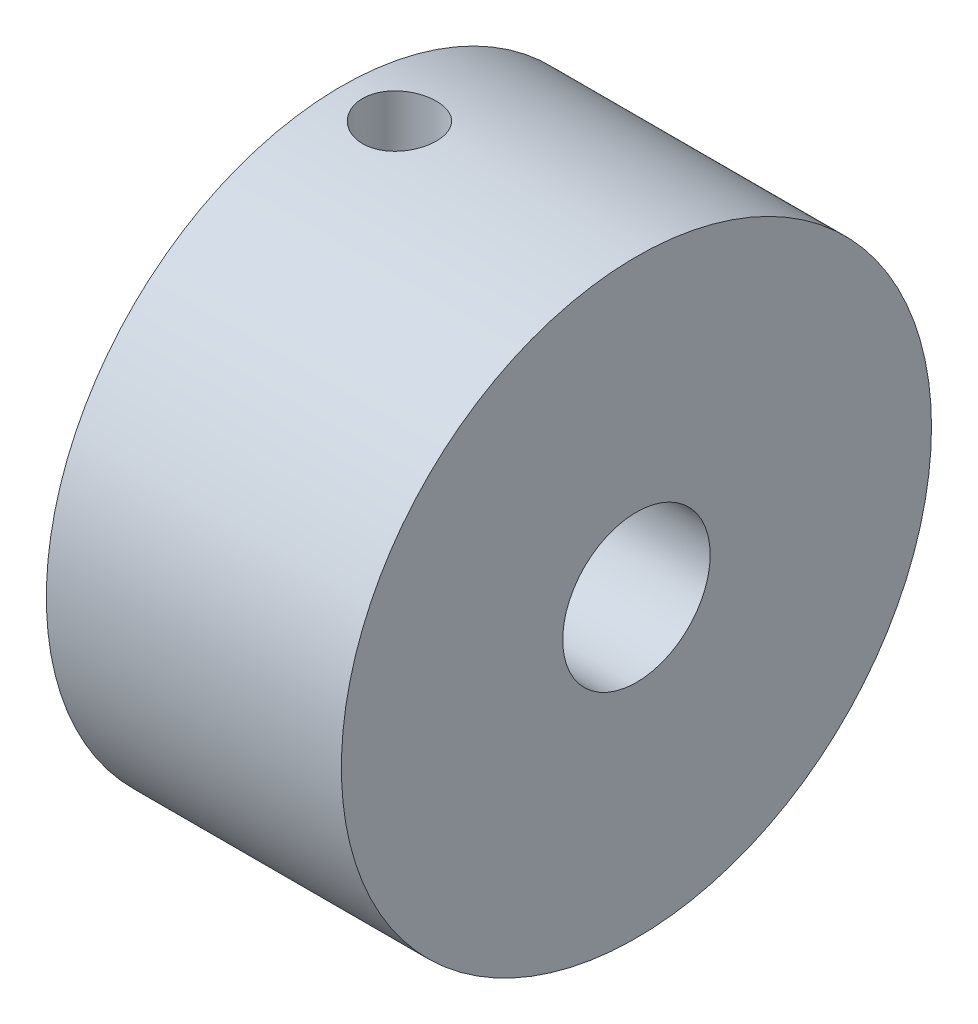
ISO-10303-21;
HEADER;
FILE_DESCRIPTION(('STEP AP214'),'2;1');
FILE_NAME('part.step','',(''),(''),'','','');
FILE_SCHEMA(('AUTOMOTIVE_DESIGN { 1 0 10303 214 1 1 1 1 }'));
ENDSEC;
DATA;
#1=APPLICATION_CONTEXT('core data for automotive mechanical design processes');
#2=APPLICATION_PROTOCOL_DEFINITION('international standard','automotive_design',2000,#1);
#3=PRODUCT_CONTEXT('',#1,'mechanical');
#4=PRODUCT('Part','Part','',(#3));
#5=PRODUCT_RELATED_PRODUCT_CATEGORY('part','',(#4));
#6=PRODUCT_DEFINITION_FORMATION('','',#4);
#7=PRODUCT_DEFINITION_CONTEXT('part definition',#1,'design');
#8=PRODUCT_DEFINITION('design','',#6,#7);
#9=PRODUCT_DEFINITION_SHAPE('','',#8);
#10=(LENGTH_UNIT() NAMED_UNIT(*) SI_UNIT(.MILLI.,.METRE.));
#11=(NAMED_UNIT(*) PLANE_ANGLE_UNIT() SI_UNIT($,.RADIAN.));
#12=(NAMED_UNIT(*) SI_UNIT($,.STERADIAN.) SOLID_ANGLE_UNIT());
#13=UNCERTAINTY_MEASURE_WITH_UNIT(LENGTH_MEASURE(1.E-05),#10,'distance_accuracy_value','');
#14=(GEOMETRIC_REPRESENTATION_CONTEXT(3) GLOBAL_UNCERTAINTY_ASSIGNED_CONTEXT((#13)) GLOBAL_UNIT_ASSIGNED_CONTEXT((#10,
#11,#12)) REPRESENTATION_CONTEXT('',''));
#15=CARTESIAN_POINT('',(0.,0.,0.));
#16=DIRECTION('',(0.,0.,1.));
#17=DIRECTION('',(1.,0.,0.));
#18=AXIS2_PLACEMENT_3D('',#15,#16,#17);
#19=CARTESIAN_POINT('',(12.7,0.,0.));
#20=DIRECTION('',(-1.,0.,0.));
#21=DIRECTION('',(0.,0.,1.));
#22=AXIS2_PLACEMENT_3D('',#19,#20,#21);
#23=CYLINDRICAL_SURFACE('',#22,12.7);
#24=CARTESIAN_POINT('',(2.5,12.6003906189451,-1.5875));
#25=CARTESIAN_POINT('',(2.58879604020781,12.6003918944879,-1.58749622481955));
#26=CARTESIAN_POINT('',(2.67764757771456,12.6013393840053,-1.58002471587851));
#27=CARTESIAN_POINT('',(2.85287789813193,12.6050255327228,-1.55033752271305));
#28=CARTESIAN_POINT('',(2.93925399861562,12.6077660635828,-1.52810643139297));
#29=CARTESIAN_POINT('',(3.10697102514368,12.614723143474,-1.46956569994448));
#30=CARTESIAN_POINT('',(3.18831532524535,12.6189386905307,-1.43326561504688));
#31=CARTESIAN_POINT('',(3.34374256690765,12.6283696093514,-1.34763776600275));
#32=CARTESIAN_POINT('',(3.41782674685684,12.6335848101502,-1.29831222898299));
#33=CARTESIAN_POINT('',(3.55706052692255,12.6444601011988,-1.1877379409179));
#34=CARTESIAN_POINT('',(3.62216361947249,12.650122284808,-1.12643082754043));
#35=CARTESIAN_POINT('',(3.74118545827631,12.6612347287615,-0.993759290526229));
#36=CARTESIAN_POINT('',(3.79510364810013,12.6666849785516,-0.92239436682685));
#37=CARTESIAN_POINT('',(3.89039192298654,12.6767808732914,-0.77134074247924));
#38=CARTESIAN_POINT('',(3.93171992363828,12.6814237979272,-0.691625296681306));
#39=CARTESIAN_POINT('',(4.00038511196251,12.6893589046612,-0.526317665965506));
#40=CARTESIAN_POINT('',(4.02772281889834,12.6926511368908,-0.440725699294174));
#41=CARTESIAN_POINT('',(4.06749246339236,12.6974991712845,-0.266570261721956));
#42=CARTESIAN_POINT('',(4.08000171586267,12.6990639772082,-0.178024700886245));
#43=CARTESIAN_POINT('',(4.0899989694982,12.7003115927805,-7.82324359571408E-05));
#44=CARTESIAN_POINT('',(4.08748756158986,12.6999944764657,0.0893226413916794));
#45=CARTESIAN_POINT('',(4.06757674624903,12.6975212633396,0.265915945798837));
#46=CARTESIAN_POINT('',(4.05026048946432,12.6953754375939,0.353117915660427));
#47=CARTESIAN_POINT('',(4.00136150283999,12.6894974552338,0.523368374079913));
#48=CARTESIAN_POINT('',(3.96977850178406,12.6857652684622,0.606416783643689));
#49=CARTESIAN_POINT('',(3.8931541270823,12.6771162370803,0.766260097803535));
#50=CARTESIAN_POINT('',(3.84807676934133,12.6721962319046,0.843037574678728));
#51=CARTESIAN_POINT('',(3.74576943999282,12.6617220035645,0.987969482214611));
#52=CARTESIAN_POINT('',(3.68853891103745,12.6561677513189,1.05612351717302));
#53=CARTESIAN_POINT('',(3.56308409519003,12.6450018087743,1.18236239954082));
#54=CARTESIAN_POINT('',(3.49478734268787,12.63938998536,1.24037524339746));
#55=CARTESIAN_POINT('',(3.34938771144314,12.6287788568227,1.34412536014694));
#56=CARTESIAN_POINT('',(3.27228480509833,12.6237795536196,1.38986259456128));
#57=CARTESIAN_POINT('',(3.11139737031792,12.6149595465908,1.46776730422503));
#58=CARTESIAN_POINT('',(3.02761001922972,12.6111393440166,1.49992901046258));
#59=CARTESIAN_POINT('',(2.85576544701046,12.6051198398493,1.54970585058723));
#60=CARTESIAN_POINT('',(2.76770843187396,12.6029204601406,1.56732168551776));
#61=CARTESIAN_POINT('',(2.59046007943015,12.6004058937787,1.58741137426196));
#62=CARTESIAN_POINT('',(2.50128039933862,12.6000780982591,1.58998655966891));
#63=CARTESIAN_POINT('',(2.32376087466246,12.6013104661098,1.5801892153014));
#64=CARTESIAN_POINT('',(2.23542101221764,12.6028705892392,1.56781700412973));
#65=CARTESIAN_POINT('',(2.06239244012806,12.6076915008733,1.52856138648155));
#66=CARTESIAN_POINT('',(1.97769242435409,12.6109465376111,1.50172704717875));
#67=CARTESIAN_POINT('',(1.81399416166825,12.6187858493146,1.43435941163874));
#68=CARTESIAN_POINT('',(1.73499611520205,12.6233701709813,1.39382563409908));
#69=CARTESIAN_POINT('',(1.58448580117875,12.633381714093,1.29996058406837));
#70=CARTESIAN_POINT('',(1.51301526752534,12.6388132588805,1.24656286093146));
#71=CARTESIAN_POINT('',(1.38001458825126,12.649893671149,1.12857962140429));
#72=CARTESIAN_POINT('',(1.31848482946383,12.6555425470767,1.06399366984018));
#73=CARTESIAN_POINT('',(1.20675634104265,12.6664598631622,0.925024677479661));
#74=CARTESIAN_POINT('',(1.15662419628518,12.6717259513445,0.850587892494316));
#75=CARTESIAN_POINT('',(1.06957473180254,12.6812491677507,0.694291589367936));
#76=CARTESIAN_POINT('',(1.03265714571459,12.685506316311,0.612432220883885));
#77=CARTESIAN_POINT('',(0.973194705313403,12.6925215456477,0.443835700553554));
#78=CARTESIAN_POINT('',(0.950611369019929,12.6952836371169,0.35711229473498));
#79=CARTESIAN_POINT('',(0.920333303341012,12.6990141922025,0.181067746371505));
#80=CARTESIAN_POINT('',(0.912637902569488,12.6999827367006,0.0917467211531987));
#81=CARTESIAN_POINT('',(0.912366699344484,12.7000166878868,-0.086307411423302));
#82=CARTESIAN_POINT('',(0.919688225039341,12.6990950181158,-0.175040377448855));
#83=CARTESIAN_POINT('',(0.949025589528582,12.6954777913529,-0.350004215822408));
#84=CARTESIAN_POINT('',(0.971041418103468,12.6927822355947,-0.436235089910503));
#85=CARTESIAN_POINT('',(1.02911020261206,12.6859187810964,-0.603733516296943));
#86=CARTESIAN_POINT('',(1.065158241402,12.6817513981589,-0.685002795701326));
#87=CARTESIAN_POINT('',(1.1502575347758,12.6724057422999,-0.840354769086453));
#88=CARTESIAN_POINT('',(1.19930894394618,12.6672274573608,-0.914437377616397));
#89=CARTESIAN_POINT('',(1.3094024417386,12.6563957814274,-1.05383759765622));
#90=CARTESIAN_POINT('',(1.37052092388752,12.6507395021211,-1.11909465527478));
#91=CARTESIAN_POINT('',(1.50285501945833,12.639612509736,-1.23846661045028));
#92=CARTESIAN_POINT('',(1.57407302120673,12.6341418409304,-1.29257886504886));
#93=CARTESIAN_POINT('',(1.72489990091283,12.6239829523563,-1.38830382899768));
#94=CARTESIAN_POINT('',(1.80454011960878,12.619297835727,-1.42986746231087));
#95=CARTESIAN_POINT('',(1.96968403027767,12.6112768990596,-1.49897165809803));
#96=CARTESIAN_POINT('',(2.05518122955766,12.6079396123271,-1.52652747222998));
#97=CARTESIAN_POINT('',(2.20093404177264,12.603802496306,-1.56023684411111));
#98=CARTESIAN_POINT('',(2.26027032422636,12.6025294146641,-1.57044582469172));
#99=CARTESIAN_POINT('',(2.379729253729,12.6008230471599,-1.5840786555));
#100=CARTESIAN_POINT('',(2.43985189480811,12.6003897549259,-1.58750255720806));
#101=CARTESIAN_POINT('',(2.5,12.6003906189451,-1.5875));
#102=B_SPLINE_CURVE_WITH_KNOTS('',3,(#24,#25,#26,#27,#28,#29,#30,#31,#32,#33,#34,#35,#36,#37,
#38,#39,#40,#41,#42,#43,#44,#45,#46,#47,#48,#49,#50,#51,#52,#53,#54,#55,#56,#57,#58,#59,#60,#61,
#62,#63,#64,#65,#66,#67,#68,#69,#70,#71,#72,#73,#74,#75,#76,#77,#78,#79,#80,#81,#82,#83,#84,#85,
#86,#87,#88,#89,#90,#91,#92,#93,#94,#95,#96,#97,#98,#99,#100,#101),.UNSPECIFIED.,.T.,.F.,(4,2,2,
2,2,2,2,2,2,2,2,2,2,2,2,2,2,2,2,2,2,2,2,2,2,2,2,2,2,2,2,2,2,2,2,2,2,2,4),(0.,0.266168389099316,
0.532615061356761,0.798881087389061,1.06510161598639,1.33265276743657,1.60021722591537,
1.86866648202545,2.13710577365792,2.40413919057825,2.67116210223019,2.93669507232479,
3.20223309051586,3.4684855980213,3.73475031857881,4.00283487834883,4.27092027843334,
4.5391194887927,4.80730577244179,5.07368313306735,5.34005481597718,5.60552838945884,
5.87101129079526,6.1378961541051,6.40479140041704,6.67320792541636,6.94161903970136,
7.20930649058436,7.47698186955734,7.74283323343041,8.00868441241109,8.27444251600496,
8.54020377912296,8.8077048184568,9.0752692220429,9.34386687042568,9.61217144098579,
9.79246828416921,9.97276375938224),.UNSPECIFIED.);
#103=CARTESIAN_POINT('',(2.5,12.6003906189451,-1.5875));
#104=VERTEX_POINT('',#103);
#105=EDGE_CURVE('E37',#104,#104,#102,.T.);
#106=ORIENTED_EDGE('',*,*,#105,.T.);
#107=EDGE_LOOP('',(#106));
#108=FACE_BOUND('',#107,.T.);
#109=CARTESIAN_POINT('',(12.7,0.,0.));
#110=DIRECTION('',(1.,0.,0.));
#111=DIRECTION('',(0.,0.,-1.));
#112=AXIS2_PLACEMENT_3D('',#109,#110,#111);
#113=CIRCLE('',#112,12.7);
#114=CARTESIAN_POINT('',(12.7,0.,-12.7));
#115=VERTEX_POINT('',#114);
#116=EDGE_CURVE('E10',#115,#115,#113,.T.);
#117=ORIENTED_EDGE('',*,*,#116,.F.);
#118=EDGE_LOOP('',(#117));
#119=FACE_BOUND('',#118,.T.);
#120=CARTESIAN_POINT('',(0.,0.,0.));
#121=DIRECTION('',(1.,0.,0.));
#122=DIRECTION('',(0.,0.,-1.));
#123=AXIS2_PLACEMENT_3D('',#120,#121,#122);
#124=CIRCLE('',#123,12.7);
#125=CARTESIAN_POINT('',(0.,0.,-12.7));
#126=VERTEX_POINT('',#125);
#127=EDGE_CURVE('E44',#126,#126,#124,.T.);
#128=ORIENTED_EDGE('',*,*,#127,.T.);
#129=EDGE_LOOP('',(#128));
#130=FACE_BOUND('',#129,.T.);
#131=ADVANCED_FACE('F33',(#108,#119,#130),#23,.T.);
#132=CARTESIAN_POINT('',(12.7,0.,0.));
#133=DIRECTION('',(1.,0.,0.));
#134=DIRECTION('',(0.,0.,-1.));
#135=AXIS2_PLACEMENT_3D('',#132,#133,#134);
#136=PLANE('',#135);
#137=CARTESIAN_POINT('',(12.7,0.,0.));
#138=DIRECTION('',(1.,0.,0.));
#139=DIRECTION('',(0.,0.,-1.));
#140=AXIS2_PLACEMENT_3D('',#137,#138,#139);
#141=CIRCLE('',#140,3.175);
#142=CARTESIAN_POINT('',(12.7,0.,-3.175));
#143=VERTEX_POINT('',#142);
#144=EDGE_CURVE('E59',#143,#143,#141,.T.);
#145=ORIENTED_EDGE('',*,*,#144,.F.);
#146=EDGE_LOOP('',(#145));
#147=FACE_BOUND('',#146,.T.);
#148=ORIENTED_EDGE('',*,*,#116,.T.);
#149=EDGE_LOOP('',(#148));
#150=FACE_BOUND('',#149,.T.);
#151=ADVANCED_FACE('F91',(#147,#150),#136,.T.);
#152=CARTESIAN_POINT('',(0.,0.,0.));
#153=DIRECTION('',(1.,0.,0.));
#154=DIRECTION('',(0.,0.,-1.));
#155=AXIS2_PLACEMENT_3D('',#152,#153,#154);
#156=PLANE('',#155);
#157=CARTESIAN_POINT('',(0.,0.,0.));
#158=DIRECTION('',(-1.,0.,0.));
#159=DIRECTION('',(0.,0.,1.));
#160=AXIS2_PLACEMENT_3D('',#157,#158,#159);
#161=CIRCLE('',#160,3.5);
#162=CARTESIAN_POINT('',(0.,0.,3.5));
#163=VERTEX_POINT('',#162);
#164=EDGE_CURVE('E51',#163,#163,#161,.T.);
#165=ORIENTED_EDGE('',*,*,#164,.F.);
#166=EDGE_LOOP('',(#165));
#167=FACE_BOUND('',#166,.T.);
#168=ORIENTED_EDGE('',*,*,#127,.F.);
#169=EDGE_LOOP('',(#168));
#170=FACE_BOUND('',#169,.T.);
#171=ADVANCED_FACE('F86',(#167,#170),#156,.F.);
#172=CARTESIAN_POINT('',(5.,0.,0.));
#173=DIRECTION('',(-1.,0.,0.));
#174=DIRECTION('',(0.,0.,1.));
#175=AXIS2_PLACEMENT_3D('',#172,#173,#174);
#176=CYLINDRICAL_SURFACE('',#175,3.5);
#177=CARTESIAN_POINT('',(2.5,3.11926974627075,-1.5875));
#178=CARTESIAN_POINT('',(2.4161468105634,3.11927469952813,-1.58749558083635));
#179=CARTESIAN_POINT('',(2.33216232474372,3.12270051069473,-1.580813484561));
#180=CARTESIAN_POINT('',(2.16668187245174,3.13593607771734,-1.55438475427074));
#181=CARTESIAN_POINT('',(2.08519257425309,3.14576160129889,-1.53460585010137));
#182=CARTESIAN_POINT('',(1.92739701460033,3.17043616807945,-1.4829504177073));
#183=CARTESIAN_POINT('',(1.85106882702513,3.18526211592426,-1.45112942701445));
#184=CARTESIAN_POINT('',(1.70485339317184,3.21823190302146,-1.37646042382742));
#185=CARTESIAN_POINT('',(1.63496544373145,3.23637537941023,-1.33361361710301));
#186=CARTESIAN_POINT('',(1.49840174056701,3.27543499871804,-1.23471985840772));
#187=CARTESIAN_POINT('',(1.43225812973366,3.29645554977554,-1.17797894448261));
#188=CARTESIAN_POINT('',(1.31002355407957,3.33805023373342,-1.05435906926123));
#189=CARTESIAN_POINT('',(1.25393690634427,3.35862417160427,-0.987475776842987));
#190=CARTESIAN_POINT('',(1.1505112925715,3.39831727452614,-0.841118407916727));
#191=CARTESIAN_POINT('',(1.10379476521927,3.41730123157187,-0.761164422355774));
#192=CARTESIAN_POINT('',(1.02471171094369,3.45036577143234,-0.593512644398512));
#193=CARTESIAN_POINT('',(0.992337691483703,3.46444891360953,-0.505818924027817));
#194=CARTESIAN_POINT('',(0.944861623154755,3.48537994942034,-0.330786596950972));
#195=CARTESIAN_POINT('',(0.928835440827173,3.49261306530712,-0.243745705670749));
#196=CARTESIAN_POINT('',(0.911499590065816,3.5004447581034,-0.0679308765972407));
#197=CARTESIAN_POINT('',(0.91018276037973,3.50104656346629,0.0208421967925786));
#198=CARTESIAN_POINT('',(0.921872006794525,3.49575634470729,0.190787459702594));
#199=CARTESIAN_POINT('',(0.93385541840991,3.4903279594494,0.2720473566017));
#200=CARTESIAN_POINT('',(0.970019635970755,3.4742513300331,0.431255793842827));
#201=CARTESIAN_POINT('',(0.994201346258583,3.46360269886422,0.50920408820875));
#202=CARTESIAN_POINT('',(1.05432358211,3.43788844461163,0.66101876142212));
#203=CARTESIAN_POINT('',(1.09043664294508,3.42275837067883,0.734805443735466));
#204=CARTESIAN_POINT('',(1.17320516947324,3.38951225901898,0.875464370224224));
#205=CARTESIAN_POINT('',(1.21986449534746,3.37139512861756,0.942334069524796));
#206=CARTESIAN_POINT('',(1.32678763630395,3.33220657512055,1.07304495741821));
#207=CARTESIAN_POINT('',(1.38784880010665,3.3110147170979,1.13619861557071));
#208=CARTESIAN_POINT('',(1.51964935974569,3.26910222408757,1.25170026298327));
#209=CARTESIAN_POINT('',(1.59039393172875,3.24838184808014,1.30404243529658));
#210=CARTESIAN_POINT('',(1.74350286215392,3.20880525771161,1.39868585931047));
#211=CARTESIAN_POINT('',(1.82624611461452,3.19007436643428,1.44043134603845));
#212=CARTESIAN_POINT('',(1.99865540773856,3.15817195754399,1.50910566793521));
#213=CARTESIAN_POINT('',(2.08831537989885,3.14499563071084,1.53604732662619));
#214=CARTESIAN_POINT('',(2.26511006353992,3.12695694904156,1.57242697107142));
#215=CARTESIAN_POINT('',(2.35195708388087,3.1215613967434,1.58299170819789));
#216=CARTESIAN_POINT('',(2.52633217491316,3.11816523918286,1.58967460005493));
#217=CARTESIAN_POINT('',(2.61385990734305,3.12016116934008,1.58579952309727));
#218=CARTESIAN_POINT('',(2.77951493948326,3.13076461989938,1.56474490869399));
#219=CARTESIAN_POINT('',(2.85782472229454,3.13881682727836,1.54868187469284));
#220=CARTESIAN_POINT('',(3.01054026789645,3.15986817503221,1.50526102680377));
#221=CARTESIAN_POINT('',(3.08494499037325,3.17286862609104,1.47790022021435));
#222=CARTESIAN_POINT('',(3.23153125718652,3.2030606197528,1.41130871848201));
#223=CARTESIAN_POINT('',(3.30345908222036,3.22041544961612,1.37159612478553));
#224=CARTESIAN_POINT('',(3.44001205142446,3.25716639749154,1.28187959812687));
#225=CARTESIAN_POINT('',(3.50463366031441,3.27656349500941,1.23187071580458));
#226=CARTESIAN_POINT('',(3.63146536142608,3.31754454425126,1.11712298070886));
#227=CARTESIAN_POINT('',(3.69279199256306,3.33915364078929,1.0514124287276));
#228=CARTESIAN_POINT('',(3.80375740319744,3.38038011426498,0.9101854185289));
#229=CARTESIAN_POINT('',(3.85339422026871,3.3999971564728,0.834667317166908));
#230=CARTESIAN_POINT('',(3.93991443199328,3.43534833404719,0.674654587072162));
#231=CARTESIAN_POINT('',(3.97665278950985,3.45103777531002,0.590071018963615));
#232=CARTESIAN_POINT('',(4.03506179287448,3.47642927541063,0.415016188790065));
#233=CARTESIAN_POINT('',(4.05674324525686,3.48613562782466,0.324549200438387));
#234=CARTESIAN_POINT('',(4.08288572081969,3.4978921137529,0.148112919884642));
#235=CARTESIAN_POINT('',(4.0885859537609,3.500492773568,0.0623630450793799));
#236=CARTESIAN_POINT('',(4.086073281839,3.49935267208743,-0.108879065124292));
#237=CARTESIAN_POINT('',(4.0778636990123,3.49561342493113,-0.194371357155574));
#238=CARTESIAN_POINT('',(4.04864311485482,3.4825252197569,-0.358435958003041));
#239=CARTESIAN_POINT('',(4.0282596069059,3.47345155633863,-0.437143993746937));
#240=CARTESIAN_POINT('',(3.97602020594994,3.4507864663423,-0.589952792019754));
#241=CARTESIAN_POINT('',(3.94416236034391,3.43719427087167,-0.664052767872483));
#242=CARTESIAN_POINT('',(3.86828528892884,3.40599464154685,-0.809302871028499));
#243=CARTESIAN_POINT('',(3.82377636359044,3.38823196079632,-0.8801629501978));
#244=CARTESIAN_POINT('',(3.72452330155038,3.35070016422292,-1.01372031497808));
#245=CARTESIAN_POINT('',(3.66977470412085,3.33093017567509,-1.07641402278755));
#246=CARTESIAN_POINT('',(3.54632175167538,3.28952581859909,-1.19725877205542));
#247=CARTESIAN_POINT('',(3.47683965332759,3.26787192300907,-1.25461127150201));
#248=CARTESIAN_POINT('',(3.32868639854161,3.22668728745559,-1.35703584747372));
#249=CARTESIAN_POINT('',(3.25000926614595,3.20715794435932,-1.40209987346015));
#250=CARTESIAN_POINT('',(3.08464974612651,3.17255125210486,-1.47875257032238));
#251=CARTESIAN_POINT('',(2.99791147803203,3.1575085769168,-1.51023708799707));
#252=CARTESIAN_POINT('',(2.81957155258714,3.13436340538964,-1.55771773696021));
#253=CARTESIAN_POINT('',(2.72798732344402,3.12623762433063,-1.573765856553));
#254=CARTESIAN_POINT('',(2.61314563539887,3.12123822327164,-1.58362601561088));
#255=CARTESIAN_POINT('',(2.59055028637813,3.12050175573591,-1.58507721906137));
#256=CARTESIAN_POINT('',(2.54530648827295,3.1195168395194,-1.58701482512146));
#257=CARTESIAN_POINT('',(2.52265803736541,3.11926840784712,-1.58750119410574));
#258=CARTESIAN_POINT('',(2.5,3.11926974627075,-1.5875));
#259=B_SPLINE_CURVE_WITH_KNOTS('',3,(#177,#178,#179,#180,#181,#182,#183,#184,#185,#186,#187,
#188,#189,#190,#191,#192,#193,#194,#195,#196,#197,#198,#199,#200,#201,#202,#203,#204,#205,#206,
#207,#208,#209,#210,#211,#212,#213,#214,#215,#216,#217,#218,#219,#220,#221,#222,#223,#224,#225,
#226,#227,#228,#229,#230,#231,#232,#233,#234,#235,#236,#237,#238,#239,#240,#241,#242,#243,#244,
#245,#246,#247,#248,#249,#250,#251,#252,#253,#254,#255,#256,#257,#258),.UNSPECIFIED.,.T.,.F.,(4,
2,2,2,2,2,2,2,2,2,2,2,2,2,2,2,2,2,2,2,2,2,2,2,2,2,2,2,2,2,2,2,2,2,2,2,2,2,2,2,4),(0.,
0.251464285831887,0.503550489511857,0.754487978957087,1.00539803783878,1.27318279505324,
1.541082228684,1.82320337457192,2.10517696587779,2.37014019842006,2.63497442791542,
2.88077353986501,3.12659087724366,3.37613099776293,3.62576260417427,3.89567712796776,
4.16573649882654,4.4479106388785,4.72983996429448,4.99134294825229,5.25272337446611,
5.49268032479522,5.73270087887207,5.98360304055623,6.23462609207465,6.51068743402489,
6.78679508675747,7.06591485691259,7.34483409160779,7.60143295758341,7.85797054951791,
8.10230554727601,8.3466821434139,8.60223888549419,8.85790721665243,9.13461770356229,
9.41150903845081,9.69048788090911,9.96852382510168,10.0364698229066,10.1044181886482),.UNSPECIFIED.);
#260=CARTESIAN_POINT('',(2.5,3.11926974627075,-1.5875));
#261=VERTEX_POINT('',#260);
#262=EDGE_CURVE('E62',#261,#261,#259,.T.);
#263=ORIENTED_EDGE('',*,*,#262,.T.);
#264=EDGE_LOOP('',(#263));
#265=FACE_BOUND('',#264,.T.);
#266=CARTESIAN_POINT('',(5.,0.,0.));
#267=DIRECTION('',(-1.,0.,0.));
#268=DIRECTION('',(0.,0.,1.));
#269=AXIS2_PLACEMENT_3D('',#266,#267,#268);
#270=CIRCLE('',#269,3.5);
#271=CARTESIAN_POINT('',(5.,0.,3.5));
#272=VERTEX_POINT('',#271);
#273=EDGE_CURVE('E49',#272,#272,#270,.T.);
#274=ORIENTED_EDGE('',*,*,#273,.F.);
#275=EDGE_LOOP('',(#274));
#276=FACE_BOUND('',#275,.T.);
#277=ORIENTED_EDGE('',*,*,#164,.T.);
#278=EDGE_LOOP('',(#277));
#279=FACE_BOUND('',#278,.T.);
#280=ADVANCED_FACE('F67',(#265,#276,#279),#176,.F.);
#281=CARTESIAN_POINT('',(5.,0.,0.));
#282=DIRECTION('',(-1.,0.,0.));
#283=DIRECTION('',(0.,0.,1.));
#284=AXIS2_PLACEMENT_3D('',#281,#282,#283);
#285=PLANE('',#284);
#286=CARTESIAN_POINT('',(5.,0.,0.));
#287=DIRECTION('',(-1.,0.,0.));
#288=DIRECTION('',(0.,0.,1.));
#289=AXIS2_PLACEMENT_3D('',#286,#287,#288);
#290=CIRCLE('',#289,3.175);
#291=CARTESIAN_POINT('',(5.,0.,3.175));
#292=VERTEX_POINT('',#291);
#293=EDGE_CURVE('E54',#292,#292,#290,.T.);
#294=ORIENTED_EDGE('',*,*,#293,.F.);
#295=EDGE_LOOP('',(#294));
#296=FACE_BOUND('',#295,.T.);
#297=ORIENTED_EDGE('',*,*,#273,.T.);
#298=EDGE_LOOP('',(#297));
#299=FACE_BOUND('',#298,.T.);
#300=ADVANCED_FACE('F79',(#296,#299),#285,.T.);
#301=CARTESIAN_POINT('',(12.7,0.,0.));
#302=DIRECTION('',(1.,0.,0.));
#303=DIRECTION('',(0.,0.,-1.));
#304=AXIS2_PLACEMENT_3D('',#301,#302,#303);
#305=CYLINDRICAL_SURFACE('',#304,3.175);
#306=ORIENTED_EDGE('',*,*,#293,.T.);
#307=EDGE_LOOP('',(#306));
#308=FACE_BOUND('',#307,.T.);
#309=ORIENTED_EDGE('',*,*,#144,.T.);
#310=EDGE_LOOP('',(#309));
#311=FACE_BOUND('',#310,.T.);
#312=ADVANCED_FACE('F75',(#308,#311),#305,.F.);
#313=CARTESIAN_POINT('',(2.5,0.,0.));
#314=DIRECTION('',(0.,-1.,0.));
#315=DIRECTION('',(0.,0.,-1.));
#316=AXIS2_PLACEMENT_3D('',#313,#314,#315);
#317=CYLINDRICAL_SURFACE('',#316,1.5875);
#318=ORIENTED_EDGE('',*,*,#105,.F.);
#319=EDGE_LOOP('',(#318));
#320=FACE_BOUND('',#319,.T.);
#321=ORIENTED_EDGE('',*,*,#262,.F.);
#322=EDGE_LOOP('',(#321));
#323=FACE_BOUND('',#322,.T.);
#324=ADVANCED_FACE('F71',(#320,#323),#317,.F.);
#325=CLOSED_SHELL('',(#131,#151,#171,#280,#300,#312,#324));
#326=MANIFOLD_SOLID_BREP('B2',#325);
#327=ADVANCED_BREP_SHAPE_REPRESENTATION('',(#18,#326),#14);
#328=SHAPE_DEFINITION_REPRESENTATION(#9,#327);
ENDSEC;
END-ISO-10303-21;
